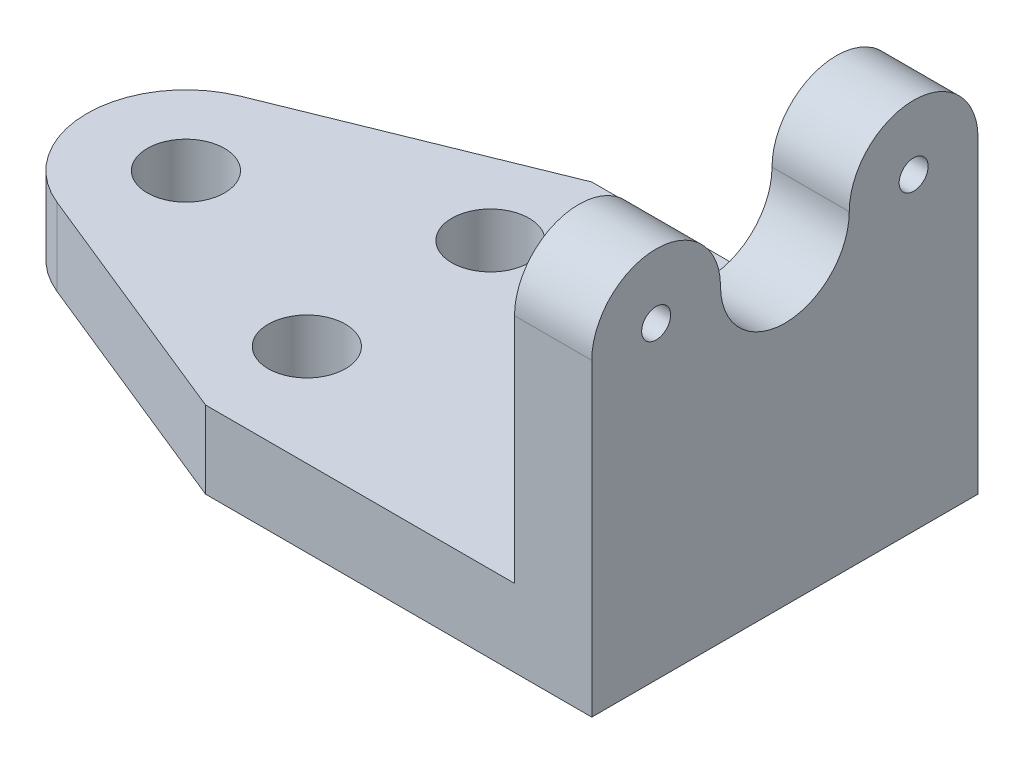
ISO-10303-21;
HEADER;
FILE_DESCRIPTION(('STEP AP214'),'2;1');
FILE_NAME('part.step','',(''),(''),'','','');
FILE_SCHEMA(('AUTOMOTIVE_DESIGN { 1 0 10303 214 1 1 1 1 }'));
ENDSEC;
DATA;
#1=APPLICATION_CONTEXT('core data for automotive mechanical design processes');
#2=APPLICATION_PROTOCOL_DEFINITION('international standard','automotive_design',2000,#1);
#3=PRODUCT_CONTEXT('',#1,'mechanical');
#4=PRODUCT('Part','Part','',(#3));
#5=PRODUCT_RELATED_PRODUCT_CATEGORY('part','',(#4));
#6=PRODUCT_DEFINITION_FORMATION('','',#4);
#7=PRODUCT_DEFINITION_CONTEXT('part definition',#1,'design');
#8=PRODUCT_DEFINITION('design','',#6,#7);
#9=PRODUCT_DEFINITION_SHAPE('','',#8);
#10=(LENGTH_UNIT() NAMED_UNIT(*) SI_UNIT(.MILLI.,.METRE.));
#11=(NAMED_UNIT(*) PLANE_ANGLE_UNIT() SI_UNIT($,.RADIAN.));
#12=(NAMED_UNIT(*) SI_UNIT($,.STERADIAN.) SOLID_ANGLE_UNIT());
#13=UNCERTAINTY_MEASURE_WITH_UNIT(LENGTH_MEASURE(1.E-05),#10,'distance_accuracy_value','');
#14=(GEOMETRIC_REPRESENTATION_CONTEXT(3) GLOBAL_UNCERTAINTY_ASSIGNED_CONTEXT((#13)) GLOBAL_UNIT_ASSIGNED_CONTEXT((#10,
#11,#12)) REPRESENTATION_CONTEXT('',''));
#15=CARTESIAN_POINT('',(0.,0.,0.));
#16=DIRECTION('',(0.,0.,1.));
#17=DIRECTION('',(1.,0.,0.));
#18=AXIS2_PLACEMENT_3D('',#15,#16,#17);
#19=CARTESIAN_POINT('',(-42.0293033507474,8.,0.));
#20=DIRECTION('',(0.,1.,0.));
#21=DIRECTION('',(0.,0.,1.));
#22=AXIS2_PLACEMENT_3D('',#19,#20,#21);
#23=PLANE('',#22);
#24=DIRECTION('',(1.,0.,0.));
#25=VECTOR('',#24,1.);
#26=CARTESIAN_POINT('',(-42.0293033507474,8.,4.));
#27=LINE('',#26,#25);
#28=CARTESIAN_POINT('',(-2.,8.,4.));
#29=VERTEX_POINT('',#28);
#30=CARTESIAN_POINT('',(12.,8.,4.));
#31=VERTEX_POINT('',#30);
#32=EDGE_CURVE('E144',#29,#31,#27,.T.);
#33=ORIENTED_EDGE('',*,*,#32,.F.);
#34=DIRECTION('',(0.,0.,-1.));
#35=VECTOR('',#34,1.);
#36=CARTESIAN_POINT('',(-2.,8.,0.));
#37=LINE('',#36,#35);
#38=CARTESIAN_POINT('',(-2.,8.,-4.));
#39=VERTEX_POINT('',#38);
#40=EDGE_CURVE('E150',#39,#29,#37,.F.);
#41=ORIENTED_EDGE('',*,*,#40,.F.);
#42=DIRECTION('',(1.,0.,0.));
#43=VECTOR('',#42,1.);
#44=CARTESIAN_POINT('',(-42.0293033507474,8.,-4.));
#45=LINE('',#44,#43);
#46=CARTESIAN_POINT('',(12.,8.,-4.));
#47=VERTEX_POINT('',#46);
#48=EDGE_CURVE('E138',#39,#47,#45,.T.);
#49=ORIENTED_EDGE('',*,*,#48,.T.);
#50=DIRECTION('',(0.,0.,1.));
#51=VECTOR('',#50,1.);
#52=CARTESIAN_POINT('',(12.,8.,0.));
#53=LINE('',#52,#51);
#54=CARTESIAN_POINT('',(12.,8.,-20.));
#55=VERTEX_POINT('',#54);
#56=EDGE_CURVE('E69',#55,#47,#53,.T.);
#57=ORIENTED_EDGE('',*,*,#56,.F.);
#58=DIRECTION('',(-1.,0.,0.));
#59=VECTOR('',#58,1.);
#60=CARTESIAN_POINT('',(-20.,8.,-20.));
#61=LINE('',#60,#59);
#62=CARTESIAN_POINT('',(-20.,8.,-20.));
#63=VERTEX_POINT('',#62);
#64=EDGE_CURVE('E252',#55,#63,#61,.T.);
#65=ORIENTED_EDGE('',*,*,#64,.T.);
#66=DIRECTION('',(-0.926721239037896,0.,0.375749577665854));
#67=VECTOR('',#66,1.);
#68=CARTESIAN_POINT('',(-20.,8.,-20.));
#69=LINE('',#68,#67);
#70=CARTESIAN_POINT('',(-45.8833379678269,8.,-9.50530871603796));
#71=VERTEX_POINT('',#70);
#72=EDGE_CURVE('E255',#63,#71,#69,.T.);
#73=ORIENTED_EDGE('',*,*,#72,.T.);
#74=CARTESIAN_POINT('',(-42.0293033507474,8.,0.));
#75=DIRECTION('',(0.,1.,0.));
#76=DIRECTION('',(0.,0.,1.));
#77=AXIS2_PLACEMENT_3D('',#74,#75,#76);
#78=CIRCLE('',#77,10.2569233504416);
#79=CARTESIAN_POINT('',(-45.8833379678269,8.,9.50530871603796));
#80=VERTEX_POINT('',#79);
#81=EDGE_CURVE('E259',#71,#80,#78,.T.);
#82=ORIENTED_EDGE('',*,*,#81,.T.);
#83=DIRECTION('',(0.926721239037896,0.,0.375749577665854));
#84=VECTOR('',#83,1.);
#85=CARTESIAN_POINT('',(-45.8833379678269,8.,9.50530871603796));
#86=LINE('',#85,#84);
#87=CARTESIAN_POINT('',(-20.,8.,20.));
#88=VERTEX_POINT('',#87);
#89=EDGE_CURVE('E262',#80,#88,#86,.T.);
#90=ORIENTED_EDGE('',*,*,#89,.T.);
#91=DIRECTION('',(1.,0.,0.));
#92=VECTOR('',#91,1.);
#93=CARTESIAN_POINT('',(-20.,8.,20.));
#94=LINE('',#93,#92);
#95=CARTESIAN_POINT('',(12.,8.,20.));
#96=VERTEX_POINT('',#95);
#97=EDGE_CURVE('E265',#88,#96,#94,.T.);
#98=ORIENTED_EDGE('',*,*,#97,.T.);
#99=EDGE_CURVE('E214',#31,#96,#53,.T.);
#100=ORIENTED_EDGE('',*,*,#99,.F.);
#101=EDGE_LOOP('',(#33,#41,#49,#57,#65,#73,#82,#90,#98,#100));
#102=FACE_BOUND('',#101,.T.);
#103=CARTESIAN_POINT('',(-42.0293033507474,8.,0.));
#104=DIRECTION('',(0.,1.,0.));
#105=DIRECTION('',(0.,0.,1.));
#106=AXIS2_PLACEMENT_3D('',#103,#104,#105);
#107=CIRCLE('',#106,4.00000000000001);
#108=CARTESIAN_POINT('',(-42.0293033507474,8.,4.00000000000001));
#109=VERTEX_POINT('',#108);
#110=EDGE_CURVE('E236',#109,#109,#107,.T.);
#111=ORIENTED_EDGE('',*,*,#110,.F.);
#112=EDGE_LOOP('',(#111));
#113=FACE_BOUND('',#112,.T.);
#114=CARTESIAN_POINT('',(-20.,8.,-9.50530871603797));
#115=DIRECTION('',(0.,1.,0.));
#116=DIRECTION('',(0.,0.,1.));
#117=AXIS2_PLACEMENT_3D('',#114,#115,#116);
#118=CIRCLE('',#117,4.);
#119=CARTESIAN_POINT('',(-20.,8.,-5.50530871603797));
#120=VERTEX_POINT('',#119);
#121=EDGE_CURVE('E244',#120,#120,#118,.T.);
#122=ORIENTED_EDGE('',*,*,#121,.F.);
#123=EDGE_LOOP('',(#122));
#124=FACE_BOUND('',#123,.T.);
#125=CARTESIAN_POINT('',(-20.,8.,9.50530871603796));
#126=DIRECTION('',(0.,1.,0.));
#127=DIRECTION('',(0.,0.,1.));
#128=AXIS2_PLACEMENT_3D('',#125,#126,#127);
#129=CIRCLE('',#128,4.);
#130=CARTESIAN_POINT('',(-20.,8.,13.505308716038));
#131=VERTEX_POINT('',#130);
#132=EDGE_CURVE('E228',#131,#131,#129,.T.);
#133=ORIENTED_EDGE('',*,*,#132,.F.);
#134=EDGE_LOOP('',(#133));
#135=FACE_BOUND('',#134,.T.);
#136=ADVANCED_FACE('F45',(#102,#113,#124,#135),#23,.T.);
#137=CARTESIAN_POINT('',(-42.0293033507474,0.,0.));
#138=DIRECTION('',(0.,1.,0.));
#139=DIRECTION('',(0.,0.,1.));
#140=AXIS2_PLACEMENT_3D('',#137,#138,#139);
#141=PLANE('',#140);
#142=DIRECTION('',(-1.,0.,0.));
#143=VECTOR('',#142,1.);
#144=CARTESIAN_POINT('',(-20.,0.,-20.));
#145=LINE('',#144,#143);
#146=CARTESIAN_POINT('',(20.,0.,-20.));
#147=VERTEX_POINT('',#146);
#148=CARTESIAN_POINT('',(-20.,0.,-20.));
#149=VERTEX_POINT('',#148);
#150=EDGE_CURVE('E272',#147,#149,#145,.T.);
#151=ORIENTED_EDGE('',*,*,#150,.F.);
#152=DIRECTION('',(0.,0.,-1.));
#153=VECTOR('',#152,1.);
#154=CARTESIAN_POINT('',(20.,0.,-20.));
#155=LINE('',#154,#153);
#156=CARTESIAN_POINT('',(20.,0.,20.));
#157=VERTEX_POINT('',#156);
#158=EDGE_CURVE('E248',#157,#147,#155,.T.);
#159=ORIENTED_EDGE('',*,*,#158,.F.);
#160=DIRECTION('',(1.,0.,0.));
#161=VECTOR('',#160,1.);
#162=CARTESIAN_POINT('',(-20.,0.,20.));
#163=LINE('',#162,#161);
#164=CARTESIAN_POINT('',(-20.,0.,20.));
#165=VERTEX_POINT('',#164);
#166=EDGE_CURVE('E256',#165,#157,#163,.T.);
#167=ORIENTED_EDGE('',*,*,#166,.F.);
#168=DIRECTION('',(0.926721239037896,0.,0.375749577665854));
#169=VECTOR('',#168,1.);
#170=CARTESIAN_POINT('',(-45.8833379678269,0.,9.50530871603796));
#171=LINE('',#170,#169);
#172=CARTESIAN_POINT('',(-45.8833379678269,0.,9.50530871603796));
#173=VERTEX_POINT('',#172);
#174=EDGE_CURVE('E281',#173,#165,#171,.T.);
#175=ORIENTED_EDGE('',*,*,#174,.F.);
#176=CARTESIAN_POINT('',(-42.0293033507474,0.,0.));
#177=DIRECTION('',(0.,1.,0.));
#178=DIRECTION('',(0.,0.,1.));
#179=AXIS2_PLACEMENT_3D('',#176,#177,#178);
#180=CIRCLE('',#179,10.2569233504416);
#181=CARTESIAN_POINT('',(-45.8833379678269,0.,-9.50530871603796));
#182=VERTEX_POINT('',#181);
#183=EDGE_CURVE('E278',#182,#173,#180,.T.);
#184=ORIENTED_EDGE('',*,*,#183,.F.);
#185=DIRECTION('',(-0.926721239037896,0.,0.375749577665854));
#186=VECTOR('',#185,1.);
#187=CARTESIAN_POINT('',(-20.,0.,-20.));
#188=LINE('',#187,#186);
#189=EDGE_CURVE('E275',#149,#182,#188,.T.);
#190=ORIENTED_EDGE('',*,*,#189,.F.);
#191=EDGE_LOOP('',(#151,#159,#167,#175,#184,#190));
#192=FACE_BOUND('',#191,.T.);
#193=CARTESIAN_POINT('',(-20.,0.,-9.50530871603797));
#194=DIRECTION('',(0.,1.,0.));
#195=DIRECTION('',(0.,0.,1.));
#196=AXIS2_PLACEMENT_3D('',#193,#194,#195);
#197=CIRCLE('',#196,4.);
#198=CARTESIAN_POINT('',(-20.,0.,-5.50530871603797));
#199=VERTEX_POINT('',#198);
#200=EDGE_CURVE('E240',#199,#199,#197,.T.);
#201=ORIENTED_EDGE('',*,*,#200,.T.);
#202=EDGE_LOOP('',(#201));
#203=FACE_BOUND('',#202,.T.);
#204=CARTESIAN_POINT('',(-42.0293033507474,0.,0.));
#205=DIRECTION('',(0.,1.,0.));
#206=DIRECTION('',(0.,0.,1.));
#207=AXIS2_PLACEMENT_3D('',#204,#205,#206);
#208=CIRCLE('',#207,4.00000000000001);
#209=CARTESIAN_POINT('',(-42.0293033507474,0.,4.00000000000001));
#210=VERTEX_POINT('',#209);
#211=EDGE_CURVE('E232',#210,#210,#208,.T.);
#212=ORIENTED_EDGE('',*,*,#211,.T.);
#213=EDGE_LOOP('',(#212));
#214=FACE_BOUND('',#213,.T.);
#215=CARTESIAN_POINT('',(-20.,0.,9.50530871603796));
#216=DIRECTION('',(0.,1.,0.));
#217=DIRECTION('',(0.,0.,1.));
#218=AXIS2_PLACEMENT_3D('',#215,#216,#217);
#219=CIRCLE('',#218,4.);
#220=CARTESIAN_POINT('',(-20.,0.,13.505308716038));
#221=VERTEX_POINT('',#220);
#222=EDGE_CURVE('E227',#221,#221,#219,.T.);
#223=ORIENTED_EDGE('',*,*,#222,.T.);
#224=EDGE_LOOP('',(#223));
#225=FACE_BOUND('',#224,.T.);
#226=ADVANCED_FACE('F358',(#192,#203,#214,#225),#141,.F.);
#227=CARTESIAN_POINT('',(20.,8.,-20.));
#228=DIRECTION('',(-1.,0.,0.));
#229=DIRECTION('',(0.,0.,1.));
#230=AXIS2_PLACEMENT_3D('',#227,#228,#229);
#231=PLANE('',#230);
#232=ORIENTED_EDGE('',*,*,#158,.T.);
#233=DIRECTION('',(0.,-1.,0.));
#234=VECTOR('',#233,1.);
#235=CARTESIAN_POINT('',(20.,8.,-20.));
#236=LINE('',#235,#234);
#237=CARTESIAN_POINT('',(20.,32.,-20.));
#238=VERTEX_POINT('',#237);
#239=EDGE_CURVE('E305',#238,#147,#236,.T.);
#240=ORIENTED_EDGE('',*,*,#239,.F.);
#241=CARTESIAN_POINT('',(20.,32.,-13.3333333333333));
#242=DIRECTION('',(1.,0.,0.));
#243=DIRECTION('',(0.,0.,1.));
#244=AXIS2_PLACEMENT_3D('',#241,#242,#243);
#245=CIRCLE('',#244,6.66666666666667);
#246=CARTESIAN_POINT('',(20.,32.,-6.66666666666667));
#247=VERTEX_POINT('',#246);
#248=EDGE_CURVE('E176',#238,#247,#245,.T.);
#249=ORIENTED_EDGE('',*,*,#248,.T.);
#250=CARTESIAN_POINT('',(20.,32.,0.));
#251=DIRECTION('',(-1.,0.,0.));
#252=DIRECTION('',(0.,0.,-1.));
#253=AXIS2_PLACEMENT_3D('',#250,#251,#252);
#254=CIRCLE('',#253,6.66666666666667);
#255=CARTESIAN_POINT('',(20.,32.,6.66666666666667));
#256=VERTEX_POINT('',#255);
#257=EDGE_CURVE('E204',#247,#256,#254,.T.);
#258=ORIENTED_EDGE('',*,*,#257,.T.);
#259=CARTESIAN_POINT('',(20.,32.,13.3333333333333));
#260=DIRECTION('',(1.,0.,0.));
#261=DIRECTION('',(0.,0.,1.));
#262=AXIS2_PLACEMENT_3D('',#259,#260,#261);
#263=CIRCLE('',#262,6.66666666666667);
#264=CARTESIAN_POINT('',(20.,32.,20.));
#265=VERTEX_POINT('',#264);
#266=EDGE_CURVE('E185',#256,#265,#263,.T.);
#267=ORIENTED_EDGE('',*,*,#266,.T.);
#268=DIRECTION('',(0.,-1.,0.));
#269=VECTOR('',#268,1.);
#270=CARTESIAN_POINT('',(20.,8.,20.));
#271=LINE('',#270,#269);
#272=EDGE_CURVE('E269',#265,#157,#271,.T.);
#273=ORIENTED_EDGE('',*,*,#272,.T.);
#274=EDGE_LOOP('',(#232,#240,#249,#258,#267,#273));
#275=FACE_BOUND('',#274,.T.);
#276=CARTESIAN_POINT('',(20.,32.,13.3333333333333));
#277=DIRECTION('',(1.,0.,0.));
#278=DIRECTION('',(0.,0.,-1.));
#279=AXIS2_PLACEMENT_3D('',#276,#277,#278);
#280=CIRCLE('',#279,1.5);
#281=CARTESIAN_POINT('',(20.,32.,11.8333333333333));
#282=VERTEX_POINT('',#281);
#283=EDGE_CURVE('E170',#282,#282,#280,.T.);
#284=ORIENTED_EDGE('',*,*,#283,.F.);
#285=EDGE_LOOP('',(#284));
#286=FACE_BOUND('',#285,.T.);
#287=CARTESIAN_POINT('',(20.,32.,-13.3333333333333));
#288=DIRECTION('',(1.,0.,0.));
#289=DIRECTION('',(0.,0.,-1.));
#290=AXIS2_PLACEMENT_3D('',#287,#288,#289);
#291=CIRCLE('',#290,1.5);
#292=CARTESIAN_POINT('',(20.,32.,-14.8333333333333));
#293=VERTEX_POINT('',#292);
#294=EDGE_CURVE('E159',#293,#293,#291,.T.);
#295=ORIENTED_EDGE('',*,*,#294,.F.);
#296=EDGE_LOOP('',(#295));
#297=FACE_BOUND('',#296,.T.);
#298=ADVANCED_FACE('F47',(#275,#286,#297),#231,.F.);
#299=CARTESIAN_POINT('',(-20.,8.,-20.));
#300=DIRECTION('',(0.,0.,1.));
#301=DIRECTION('',(1.,0.,0.));
#302=AXIS2_PLACEMENT_3D('',#299,#300,#301);
#303=PLANE('',#302);
#304=ORIENTED_EDGE('',*,*,#64,.F.);
#305=DIRECTION('',(0.,1.,0.));
#306=VECTOR('',#305,1.);
#307=CARTESIAN_POINT('',(12.,0.,-20.));
#308=LINE('',#307,#306);
#309=CARTESIAN_POINT('',(12.,32.,-20.));
#310=VERTEX_POINT('',#309);
#311=EDGE_CURVE('E184',#55,#310,#308,.T.);
#312=ORIENTED_EDGE('',*,*,#311,.T.);
#313=DIRECTION('',(1.,0.,0.));
#314=VECTOR('',#313,1.);
#315=CARTESIAN_POINT('',(12.,32.,-20.));
#316=LINE('',#315,#314);
#317=EDGE_CURVE('E200',#310,#238,#316,.T.);
#318=ORIENTED_EDGE('',*,*,#317,.T.);
#319=ORIENTED_EDGE('',*,*,#239,.T.);
#320=ORIENTED_EDGE('',*,*,#150,.T.);
#321=DIRECTION('',(0.,-1.,0.));
#322=VECTOR('',#321,1.);
#323=CARTESIAN_POINT('',(-20.,8.,-20.));
#324=LINE('',#323,#322);
#325=EDGE_CURVE('E301',#63,#149,#324,.T.);
#326=ORIENTED_EDGE('',*,*,#325,.F.);
#327=EDGE_LOOP('',(#304,#312,#318,#319,#320,#326));
#328=FACE_BOUND('',#327,.T.);
#329=ADVANCED_FACE('F340',(#328),#303,.F.);
#330=CARTESIAN_POINT('',(-20.,8.,-20.));
#331=DIRECTION('',(0.375749577665854,0.,0.926721239037896));
#332=DIRECTION('',(0.926721239037896,0.,-0.375749577665854));
#333=AXIS2_PLACEMENT_3D('',#330,#331,#332);
#334=PLANE('',#333);
#335=ORIENTED_EDGE('',*,*,#189,.T.);
#336=DIRECTION('',(0.,-1.,0.));
#337=VECTOR('',#336,1.);
#338=CARTESIAN_POINT('',(-45.8833379678269,8.,-9.50530871603796));
#339=LINE('',#338,#337);
#340=EDGE_CURVE('E297',#71,#182,#339,.T.);
#341=ORIENTED_EDGE('',*,*,#340,.F.);
#342=ORIENTED_EDGE('',*,*,#72,.F.);
#343=ORIENTED_EDGE('',*,*,#325,.T.);
#344=EDGE_LOOP('',(#335,#341,#342,#343));
#345=FACE_BOUND('',#344,.T.);
#346=ADVANCED_FACE('F347',(#345),#334,.F.);
#347=CARTESIAN_POINT('',(-42.0293033507474,8.,0.));
#348=DIRECTION('',(0.,-1.,0.));
#349=DIRECTION('',(0.,0.,-1.));
#350=AXIS2_PLACEMENT_3D('',#347,#348,#349);
#351=CYLINDRICAL_SURFACE('',#350,10.2569233504416);
#352=ORIENTED_EDGE('',*,*,#183,.T.);
#353=DIRECTION('',(0.,-1.,0.));
#354=VECTOR('',#353,1.);
#355=CARTESIAN_POINT('',(-45.8833379678269,8.,9.50530871603796));
#356=LINE('',#355,#354);
#357=EDGE_CURVE('E293',#80,#173,#356,.T.);
#358=ORIENTED_EDGE('',*,*,#357,.F.);
#359=ORIENTED_EDGE('',*,*,#81,.F.);
#360=ORIENTED_EDGE('',*,*,#340,.T.);
#361=EDGE_LOOP('',(#352,#358,#359,#360));
#362=FACE_BOUND('',#361,.T.);
#363=ADVANCED_FACE('F351',(#362),#351,.T.);
#364=CARTESIAN_POINT('',(-45.8833379678269,8.,9.50530871603796));
#365=DIRECTION('',(0.375749577665854,0.,-0.926721239037896));
#366=DIRECTION('',(-0.926721239037896,0.,-0.375749577665854));
#367=AXIS2_PLACEMENT_3D('',#364,#365,#366);
#368=PLANE('',#367);
#369=ORIENTED_EDGE('',*,*,#174,.T.);
#370=DIRECTION('',(0.,-1.,0.));
#371=VECTOR('',#370,1.);
#372=CARTESIAN_POINT('',(-20.,8.,20.));
#373=LINE('',#372,#371);
#374=EDGE_CURVE('E289',#88,#165,#373,.T.);
#375=ORIENTED_EDGE('',*,*,#374,.F.);
#376=ORIENTED_EDGE('',*,*,#89,.F.);
#377=ORIENTED_EDGE('',*,*,#357,.T.);
#378=EDGE_LOOP('',(#369,#375,#376,#377));
#379=FACE_BOUND('',#378,.T.);
#380=ADVANCED_FACE('F354',(#379),#368,.F.);
#381=CARTESIAN_POINT('',(-20.,8.,20.));
#382=DIRECTION('',(0.,0.,-1.));
#383=DIRECTION('',(-1.,0.,0.));
#384=AXIS2_PLACEMENT_3D('',#381,#382,#383);
#385=PLANE('',#384);
#386=ORIENTED_EDGE('',*,*,#166,.T.);
#387=ORIENTED_EDGE('',*,*,#272,.F.);
#388=DIRECTION('',(1.,0.,0.));
#389=VECTOR('',#388,1.);
#390=CARTESIAN_POINT('',(12.,32.,20.));
#391=LINE('',#390,#389);
#392=CARTESIAN_POINT('',(12.,32.,20.));
#393=VERTEX_POINT('',#392);
#394=EDGE_CURVE('E210',#393,#265,#391,.T.);
#395=ORIENTED_EDGE('',*,*,#394,.F.);
#396=DIRECTION('',(0.,-1.,0.));
#397=VECTOR('',#396,1.);
#398=CARTESIAN_POINT('',(12.,0.,20.));
#399=LINE('',#398,#397);
#400=EDGE_CURVE('E180',#393,#96,#399,.T.);
#401=ORIENTED_EDGE('',*,*,#400,.T.);
#402=ORIENTED_EDGE('',*,*,#97,.F.);
#403=ORIENTED_EDGE('',*,*,#374,.T.);
#404=EDGE_LOOP('',(#386,#387,#395,#401,#402,#403));
#405=FACE_BOUND('',#404,.T.);
#406=ADVANCED_FACE('F322',(#405),#385,.F.);
#407=CARTESIAN_POINT('',(-20.,8.,-9.50530871603797));
#408=DIRECTION('',(0.,-1.,0.));
#409=DIRECTION('',(0.,0.,-1.));
#410=AXIS2_PLACEMENT_3D('',#407,#408,#409);
#411=CYLINDRICAL_SURFACE('',#410,4.);
#412=ORIENTED_EDGE('',*,*,#121,.T.);
#413=EDGE_LOOP('',(#412));
#414=FACE_BOUND('',#413,.T.);
#415=ORIENTED_EDGE('',*,*,#200,.F.);
#416=EDGE_LOOP('',(#415));
#417=FACE_BOUND('',#416,.T.);
#418=ADVANCED_FACE('F379',(#414,#417),#411,.F.);
#419=CARTESIAN_POINT('',(-42.0293033507474,8.,0.));
#420=DIRECTION('',(0.,-1.,0.));
#421=DIRECTION('',(0.,0.,-1.));
#422=AXIS2_PLACEMENT_3D('',#419,#420,#421);
#423=CYLINDRICAL_SURFACE('',#422,4.00000000000001);
#424=ORIENTED_EDGE('',*,*,#110,.T.);
#425=EDGE_LOOP('',(#424));
#426=FACE_BOUND('',#425,.T.);
#427=ORIENTED_EDGE('',*,*,#211,.F.);
#428=EDGE_LOOP('',(#427));
#429=FACE_BOUND('',#428,.T.);
#430=ADVANCED_FACE('F370',(#426,#429),#423,.F.);
#431=CARTESIAN_POINT('',(-20.,8.,9.50530871603796));
#432=DIRECTION('',(0.,-1.,0.));
#433=DIRECTION('',(0.,0.,-1.));
#434=AXIS2_PLACEMENT_3D('',#431,#432,#433);
#435=CYLINDRICAL_SURFACE('',#434,4.);
#436=ORIENTED_EDGE('',*,*,#132,.T.);
#437=EDGE_LOOP('',(#436));
#438=FACE_BOUND('',#437,.T.);
#439=ORIENTED_EDGE('',*,*,#222,.F.);
#440=EDGE_LOOP('',(#439));
#441=FACE_BOUND('',#440,.T.);
#442=ADVANCED_FACE('F368',(#438,#441),#435,.F.);
#443=CARTESIAN_POINT('',(12.,32.,13.3333333333333));
#444=DIRECTION('',(1.,0.,0.));
#445=DIRECTION('',(0.,0.,-1.));
#446=AXIS2_PLACEMENT_3D('',#443,#444,#445);
#447=CYLINDRICAL_SURFACE('',#446,6.66666666666667);
#448=ORIENTED_EDGE('',*,*,#266,.F.);
#449=DIRECTION('',(1.,0.,0.));
#450=VECTOR('',#449,1.);
#451=CARTESIAN_POINT('',(12.,32.,6.66666666666667));
#452=LINE('',#451,#450);
#453=CARTESIAN_POINT('',(12.,32.,6.66666666666667));
#454=VERTEX_POINT('',#453);
#455=EDGE_CURVE('E215',#454,#256,#452,.T.);
#456=ORIENTED_EDGE('',*,*,#455,.F.);
#457=CARTESIAN_POINT('',(12.,32.,13.3333333333333));
#458=DIRECTION('',(1.,0.,0.));
#459=DIRECTION('',(0.,0.,1.));
#460=AXIS2_PLACEMENT_3D('',#457,#458,#459);
#461=CIRCLE('',#460,6.66666666666667);
#462=EDGE_CURVE('E196',#454,#393,#461,.T.);
#463=ORIENTED_EDGE('',*,*,#462,.T.);
#464=ORIENTED_EDGE('',*,*,#394,.T.);
#465=EDGE_LOOP('',(#448,#456,#463,#464));
#466=FACE_BOUND('',#465,.T.);
#467=ADVANCED_FACE('F325',(#466),#447,.T.);
#468=CARTESIAN_POINT('',(12.,32.,0.));
#469=DIRECTION('',(1.,0.,0.));
#470=DIRECTION('',(0.,0.,-1.));
#471=AXIS2_PLACEMENT_3D('',#468,#469,#470);
#472=CYLINDRICAL_SURFACE('',#471,6.66666666666667);
#473=ORIENTED_EDGE('',*,*,#455,.T.);
#474=ORIENTED_EDGE('',*,*,#257,.F.);
#475=DIRECTION('',(1.,0.,0.));
#476=VECTOR('',#475,1.);
#477=CARTESIAN_POINT('',(12.,32.,-6.66666666666667));
#478=LINE('',#477,#476);
#479=CARTESIAN_POINT('',(12.,32.,-6.66666666666667));
#480=VERTEX_POINT('',#479);
#481=EDGE_CURVE('E219',#480,#247,#478,.T.);
#482=ORIENTED_EDGE('',*,*,#481,.F.);
#483=CARTESIAN_POINT('',(12.,32.,0.));
#484=DIRECTION('',(-1.,0.,0.));
#485=DIRECTION('',(0.,0.,-1.));
#486=AXIS2_PLACEMENT_3D('',#483,#484,#485);
#487=CIRCLE('',#486,6.66666666666667);
#488=EDGE_CURVE('E192',#480,#454,#487,.T.);
#489=ORIENTED_EDGE('',*,*,#488,.T.);
#490=EDGE_LOOP('',(#473,#474,#482,#489));
#491=FACE_BOUND('',#490,.T.);
#492=ADVANCED_FACE('F332',(#491),#472,.F.);
#493=CARTESIAN_POINT('',(12.,32.,-13.3333333333333));
#494=DIRECTION('',(1.,0.,0.));
#495=DIRECTION('',(0.,0.,-1.));
#496=AXIS2_PLACEMENT_3D('',#493,#494,#495);
#497=CYLINDRICAL_SURFACE('',#496,6.66666666666667);
#498=ORIENTED_EDGE('',*,*,#248,.F.);
#499=ORIENTED_EDGE('',*,*,#317,.F.);
#500=CARTESIAN_POINT('',(12.,32.,-13.3333333333333));
#501=DIRECTION('',(1.,0.,0.));
#502=DIRECTION('',(0.,0.,1.));
#503=AXIS2_PLACEMENT_3D('',#500,#501,#502);
#504=CIRCLE('',#503,6.66666666666667);
#505=EDGE_CURVE('E188',#310,#480,#504,.T.);
#506=ORIENTED_EDGE('',*,*,#505,.T.);
#507=ORIENTED_EDGE('',*,*,#481,.T.);
#508=EDGE_LOOP('',(#498,#499,#506,#507));
#509=FACE_BOUND('',#508,.T.);
#510=ADVANCED_FACE('F338',(#509),#497,.T.);
#511=CARTESIAN_POINT('',(12.,32.,13.3333333333333));
#512=DIRECTION('',(-1.,0.,0.));
#513=DIRECTION('',(0.,0.,1.));
#514=AXIS2_PLACEMENT_3D('',#511,#512,#513);
#515=PLANE('',#514);
#516=DIRECTION('',(0.,1.,0.));
#517=VECTOR('',#516,1.);
#518=CARTESIAN_POINT('',(12.,32.,4.));
#519=LINE('',#518,#517);
#520=CARTESIAN_POINT('',(12.,22.,4.));
#521=VERTEX_POINT('',#520);
#522=EDGE_CURVE('E11',#31,#521,#519,.T.);
#523=ORIENTED_EDGE('',*,*,#522,.F.);
#524=ORIENTED_EDGE('',*,*,#99,.T.);
#525=ORIENTED_EDGE('',*,*,#400,.F.);
#526=ORIENTED_EDGE('',*,*,#462,.F.);
#527=ORIENTED_EDGE('',*,*,#488,.F.);
#528=ORIENTED_EDGE('',*,*,#505,.F.);
#529=ORIENTED_EDGE('',*,*,#311,.F.);
#530=ORIENTED_EDGE('',*,*,#56,.T.);
#531=DIRECTION('',(0.,1.,0.));
#532=VECTOR('',#531,1.);
#533=CARTESIAN_POINT('',(12.,32.,-4.));
#534=LINE('',#533,#532);
#535=CARTESIAN_POINT('',(12.,22.,-4.));
#536=VERTEX_POINT('',#535);
#537=EDGE_CURVE('E141',#47,#536,#534,.T.);
#538=ORIENTED_EDGE('',*,*,#537,.T.);
#539=DIRECTION('',(0.,0.,1.));
#540=VECTOR('',#539,1.);
#541=CARTESIAN_POINT('',(12.,22.,13.3333333333333));
#542=LINE('',#541,#540);
#543=EDGE_CURVE('E54',#521,#536,#542,.F.);
#544=ORIENTED_EDGE('',*,*,#543,.F.);
#545=EDGE_LOOP('',(#523,#524,#525,#526,#527,#528,#529,#530,#538,#544));
#546=FACE_BOUND('',#545,.T.);
#547=CARTESIAN_POINT('',(12.,32.,-13.3333333333333));
#548=DIRECTION('',(1.,0.,0.));
#549=DIRECTION('',(0.,0.,-1.));
#550=AXIS2_PLACEMENT_3D('',#547,#548,#549);
#551=CIRCLE('',#550,1.5);
#552=CARTESIAN_POINT('',(12.,32.,-14.8333333333333));
#553=VERTEX_POINT('',#552);
#554=EDGE_CURVE('E164',#553,#553,#551,.T.);
#555=ORIENTED_EDGE('',*,*,#554,.T.);
#556=EDGE_LOOP('',(#555));
#557=FACE_BOUND('',#556,.T.);
#558=CARTESIAN_POINT('',(12.,32.,13.3333333333333));
#559=DIRECTION('',(1.,0.,0.));
#560=DIRECTION('',(0.,0.,-1.));
#561=AXIS2_PLACEMENT_3D('',#558,#559,#560);
#562=CIRCLE('',#561,1.5);
#563=CARTESIAN_POINT('',(12.,32.,11.8333333333333));
#564=VERTEX_POINT('',#563);
#565=EDGE_CURVE('E172',#564,#564,#562,.T.);
#566=ORIENTED_EDGE('',*,*,#565,.T.);
#567=EDGE_LOOP('',(#566));
#568=FACE_BOUND('',#567,.T.);
#569=ADVANCED_FACE('F315',(#546,#557,#568),#515,.T.);
#570=CARTESIAN_POINT('',(12.,32.,13.3333333333333));
#571=DIRECTION('',(1.,0.,0.));
#572=DIRECTION('',(0.,0.,-1.));
#573=AXIS2_PLACEMENT_3D('',#570,#571,#572);
#574=CYLINDRICAL_SURFACE('',#573,1.5);
#575=ORIENTED_EDGE('',*,*,#565,.F.);
#576=EDGE_LOOP('',(#575));
#577=FACE_BOUND('',#576,.T.);
#578=ORIENTED_EDGE('',*,*,#283,.T.);
#579=EDGE_LOOP('',(#578));
#580=FACE_BOUND('',#579,.T.);
#581=ADVANCED_FACE('F420',(#577,#580),#574,.F.);
#582=CARTESIAN_POINT('',(12.,32.,-13.3333333333333));
#583=DIRECTION('',(1.,0.,0.));
#584=DIRECTION('',(0.,0.,-1.));
#585=AXIS2_PLACEMENT_3D('',#582,#583,#584);
#586=CYLINDRICAL_SURFACE('',#585,1.5);
#587=ORIENTED_EDGE('',*,*,#554,.F.);
#588=EDGE_LOOP('',(#587));
#589=FACE_BOUND('',#588,.T.);
#590=ORIENTED_EDGE('',*,*,#294,.T.);
#591=EDGE_LOOP('',(#590));
#592=FACE_BOUND('',#591,.T.);
#593=ADVANCED_FACE('F430',(#589,#592),#586,.F.);
#594=CARTESIAN_POINT('',(-2.,8.,0.));
#595=DIRECTION('',(0.707106781186547,-0.707106781186548,0.));
#596=DIRECTION('',(0.707106781186548,0.707106781186547,0.));
#597=AXIS2_PLACEMENT_3D('',#594,#595,#596);
#598=PLANE('',#597);
#599=DIRECTION('',(0.707106781186548,0.707106781186547,0.));
#600=VECTOR('',#599,1.);
#601=CARTESIAN_POINT('',(-2.,8.,-4.));
#602=LINE('',#601,#600);
#603=EDGE_CURVE('E61',#39,#536,#602,.T.);
#604=ORIENTED_EDGE('',*,*,#603,.F.);
#605=ORIENTED_EDGE('',*,*,#40,.T.);
#606=DIRECTION('',(0.707106781186548,0.707106781186547,0.));
#607=VECTOR('',#606,1.);
#608=CARTESIAN_POINT('',(-2.,8.,4.));
#609=LINE('',#608,#607);
#610=EDGE_CURVE('E145',#29,#521,#609,.T.);
#611=ORIENTED_EDGE('',*,*,#610,.T.);
#612=ORIENTED_EDGE('',*,*,#543,.T.);
#613=EDGE_LOOP('',(#604,#605,#611,#612));
#614=FACE_BOUND('',#613,.T.);
#615=ADVANCED_FACE('F148',(#614),#598,.F.);
#616=CARTESIAN_POINT('',(-16.1431133505945,19.3333333333333,4.));
#617=DIRECTION('',(0.,0.,1.));
#618=DIRECTION('',(1.,0.,0.));
#619=AXIS2_PLACEMENT_3D('',#616,#617,#618);
#620=PLANE('',#619);
#621=ORIENTED_EDGE('',*,*,#610,.F.);
#622=ORIENTED_EDGE('',*,*,#32,.T.);
#623=ORIENTED_EDGE('',*,*,#522,.T.);
#624=EDGE_LOOP('',(#621,#622,#623));
#625=FACE_BOUND('',#624,.T.);
#626=ADVANCED_FACE('F429',(#625),#620,.T.);
#627=CARTESIAN_POINT('',(-16.1431133505945,19.3333333333333,-4.));
#628=DIRECTION('',(0.,0.,1.));
#629=DIRECTION('',(1.,0.,0.));
#630=AXIS2_PLACEMENT_3D('',#627,#628,#629);
#631=PLANE('',#630);
#632=ORIENTED_EDGE('',*,*,#48,.F.);
#633=ORIENTED_EDGE('',*,*,#603,.T.);
#634=ORIENTED_EDGE('',*,*,#537,.F.);
#635=EDGE_LOOP('',(#632,#633,#634));
#636=FACE_BOUND('',#635,.T.);
#637=ADVANCED_FACE('F139',(#636),#631,.F.);
#638=CLOSED_SHELL('',(#136,#226,#298,#329,#346,#363,#380,#406,#418,#430,#442,#467,#492,#510,
#569,#581,#593,#615,#626,#637));
#639=MANIFOLD_SOLID_BREP('B2',#638);
#640=ADVANCED_BREP_SHAPE_REPRESENTATION('',(#18,#639),#14);
#641=SHAPE_DEFINITION_REPRESENTATION(#9,#640);
ENDSEC;
END-ISO-10303-21;
